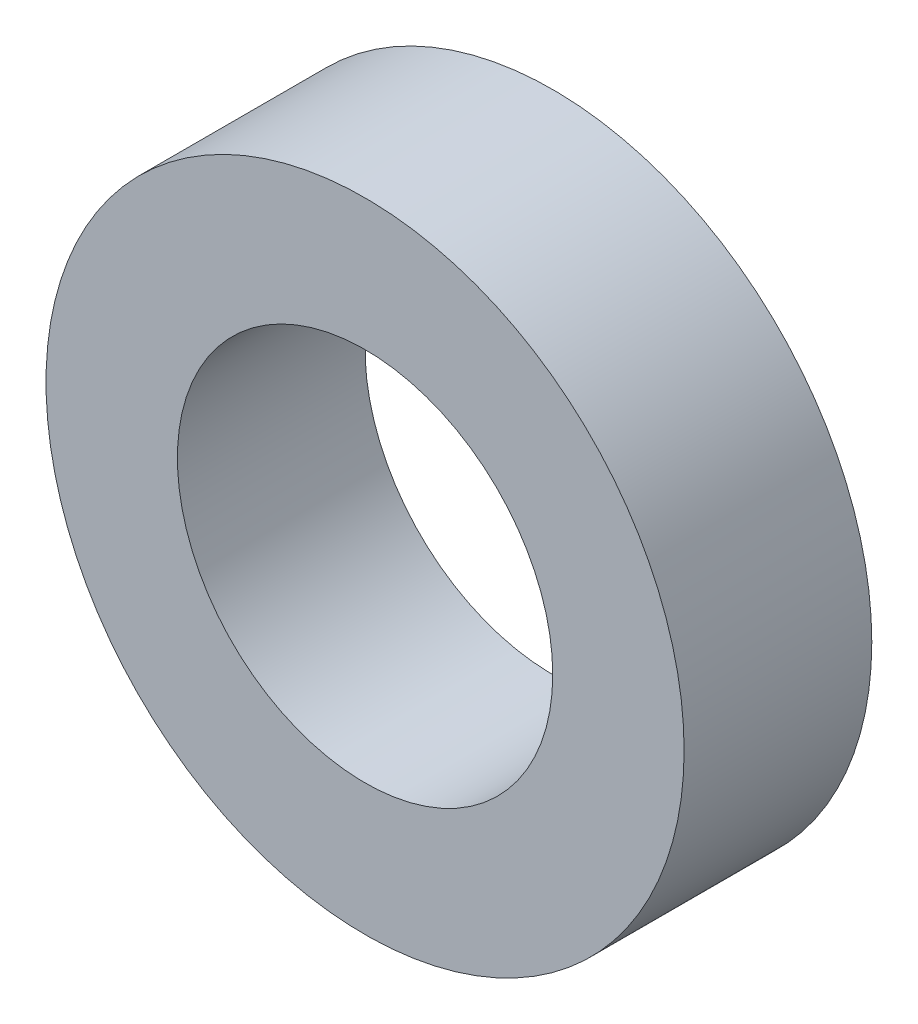
ISO-10303-21;
HEADER;
FILE_DESCRIPTION(('STEP AP214'),'2;1');
FILE_NAME('part.step','',(''),(''),'','','');
FILE_SCHEMA(('AUTOMOTIVE_DESIGN { 1 0 10303 214 1 1 1 1 }'));
ENDSEC;
DATA;
#1=APPLICATION_CONTEXT('core data for automotive mechanical design processes');
#2=APPLICATION_PROTOCOL_DEFINITION('international standard','automotive_design',2000,#1);
#3=PRODUCT_CONTEXT('',#1,'mechanical');
#4=PRODUCT('Part','Part','',(#3));
#5=PRODUCT_RELATED_PRODUCT_CATEGORY('part','',(#4));
#6=PRODUCT_DEFINITION_FORMATION('','',#4);
#7=PRODUCT_DEFINITION_CONTEXT('part definition',#1,'design');
#8=PRODUCT_DEFINITION('design','',#6,#7);
#9=PRODUCT_DEFINITION_SHAPE('','',#8);
#10=(LENGTH_UNIT() NAMED_UNIT(*) SI_UNIT(.MILLI.,.METRE.));
#11=(NAMED_UNIT(*) PLANE_ANGLE_UNIT() SI_UNIT($,.RADIAN.));
#12=(NAMED_UNIT(*) SI_UNIT($,.STERADIAN.) SOLID_ANGLE_UNIT());
#13=UNCERTAINTY_MEASURE_WITH_UNIT(LENGTH_MEASURE(1.E-05),#10,'distance_accuracy_value','');
#14=(GEOMETRIC_REPRESENTATION_CONTEXT(3) GLOBAL_UNCERTAINTY_ASSIGNED_CONTEXT((#13)) GLOBAL_UNIT_ASSIGNED_CONTEXT((#10,
#11,#12)) REPRESENTATION_CONTEXT('',''));
#15=CARTESIAN_POINT('',(0.,0.,0.));
#16=DIRECTION('',(0.,0.,1.));
#17=DIRECTION('',(1.,0.,0.));
#18=AXIS2_PLACEMENT_3D('',#15,#16,#17);
#19=CARTESIAN_POINT('',(0.,0.,5.));
#20=DIRECTION('',(0.,0.,1.));
#21=DIRECTION('',(1.,0.,0.));
#22=AXIS2_PLACEMENT_3D('',#19,#20,#21);
#23=PLANE('',#22);
#24=CARTESIAN_POINT('',(0.,0.,5.));
#25=DIRECTION('',(0.,0.,1.));
#26=DIRECTION('',(1.,0.,0.));
#27=AXIS2_PLACEMENT_3D('',#24,#25,#26);
#28=CIRCLE('',#27,8.5);
#29=CARTESIAN_POINT('',(8.5,0.,5.));
#30=VERTEX_POINT('',#29);
#31=EDGE_CURVE('E10',#30,#30,#28,.T.);
#32=ORIENTED_EDGE('',*,*,#31,.T.);
#33=EDGE_LOOP('',(#32));
#34=FACE_BOUND('',#33,.T.);
#35=CARTESIAN_POINT('',(0.,0.,5.));
#36=DIRECTION('',(0.,0.,1.));
#37=DIRECTION('',(1.,0.,0.));
#38=AXIS2_PLACEMENT_3D('',#35,#36,#37);
#39=CIRCLE('',#38,5.);
#40=CARTESIAN_POINT('',(5.,0.,5.));
#41=VERTEX_POINT('',#40);
#42=EDGE_CURVE('E42',#41,#41,#39,.T.);
#43=ORIENTED_EDGE('',*,*,#42,.F.);
#44=EDGE_LOOP('',(#43));
#45=FACE_BOUND('',#44,.T.);
#46=ADVANCED_FACE('F31',(#34,#45),#23,.T.);
#47=CARTESIAN_POINT('',(0.,0.,0.));
#48=DIRECTION('',(0.,0.,1.));
#49=DIRECTION('',(1.,0.,0.));
#50=AXIS2_PLACEMENT_3D('',#47,#48,#49);
#51=PLANE('',#50);
#52=CARTESIAN_POINT('',(0.,0.,0.));
#53=DIRECTION('',(0.,0.,1.));
#54=DIRECTION('',(1.,0.,0.));
#55=AXIS2_PLACEMENT_3D('',#52,#53,#54);
#56=CIRCLE('',#55,8.5);
#57=CARTESIAN_POINT('',(8.5,0.,0.));
#58=VERTEX_POINT('',#57);
#59=EDGE_CURVE('E35',#58,#58,#56,.T.);
#60=ORIENTED_EDGE('',*,*,#59,.F.);
#61=EDGE_LOOP('',(#60));
#62=FACE_BOUND('',#61,.T.);
#63=CARTESIAN_POINT('',(0.,0.,0.));
#64=DIRECTION('',(0.,0.,1.));
#65=DIRECTION('',(1.,0.,0.));
#66=AXIS2_PLACEMENT_3D('',#63,#64,#65);
#67=CIRCLE('',#66,5.);
#68=CARTESIAN_POINT('',(5.,0.,0.));
#69=VERTEX_POINT('',#68);
#70=EDGE_CURVE('E44',#69,#69,#67,.T.);
#71=ORIENTED_EDGE('',*,*,#70,.T.);
#72=EDGE_LOOP('',(#71));
#73=FACE_BOUND('',#72,.T.);
#74=ADVANCED_FACE('F54',(#62,#73),#51,.F.);
#75=CARTESIAN_POINT('',(0.,0.,5.));
#76=DIRECTION('',(0.,0.,-1.));
#77=DIRECTION('',(-1.,0.,0.));
#78=AXIS2_PLACEMENT_3D('',#75,#76,#77);
#79=CYLINDRICAL_SURFACE('',#78,8.5);
#80=ORIENTED_EDGE('',*,*,#31,.F.);
#81=EDGE_LOOP('',(#80));
#82=FACE_BOUND('',#81,.T.);
#83=ORIENTED_EDGE('',*,*,#59,.T.);
#84=EDGE_LOOP('',(#83));
#85=FACE_BOUND('',#84,.T.);
#86=ADVANCED_FACE('F33',(#82,#85),#79,.T.);
#87=CARTESIAN_POINT('',(0.,0.,5.));
#88=DIRECTION('',(0.,0.,-1.));
#89=DIRECTION('',(-1.,0.,0.));
#90=AXIS2_PLACEMENT_3D('',#87,#88,#89);
#91=CYLINDRICAL_SURFACE('',#90,5.);
#92=ORIENTED_EDGE('',*,*,#42,.T.);
#93=EDGE_LOOP('',(#92));
#94=FACE_BOUND('',#93,.T.);
#95=ORIENTED_EDGE('',*,*,#70,.F.);
#96=EDGE_LOOP('',(#95));
#97=FACE_BOUND('',#96,.T.);
#98=ADVANCED_FACE('F50',(#94,#97),#91,.F.);
#99=CLOSED_SHELL('',(#46,#74,#86,#98));
#100=MANIFOLD_SOLID_BREP('B2',#99);
#101=ADVANCED_BREP_SHAPE_REPRESENTATION('',(#18,#100),#14);
#102=SHAPE_DEFINITION_REPRESENTATION(#9,#101);
ENDSEC;
END-ISO-10303-21;
